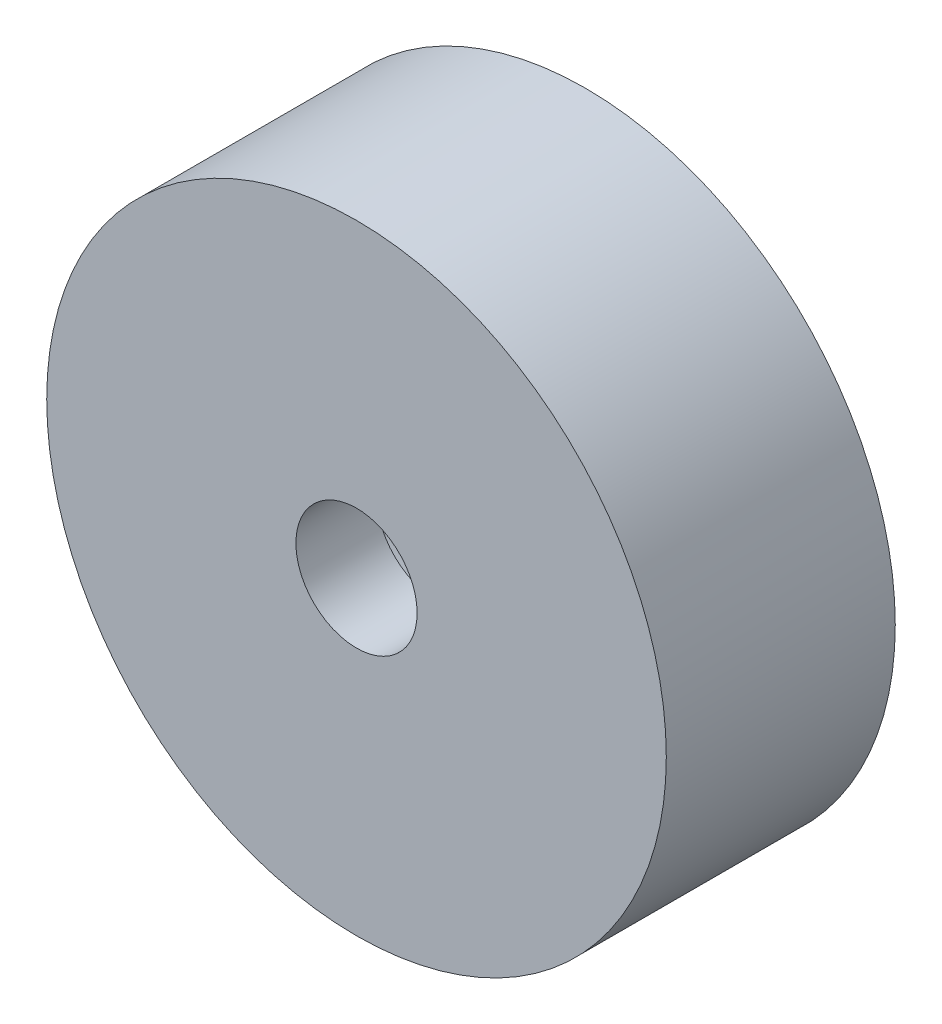
ISO-10303-21;
HEADER;
FILE_DESCRIPTION(('STEP AP214'),'2;1');
FILE_NAME('part.step','',(''),(''),'','','');
FILE_SCHEMA(('AUTOMOTIVE_DESIGN { 1 0 10303 214 1 1 1 1 }'));
ENDSEC;
DATA;
#1=APPLICATION_CONTEXT('core data for automotive mechanical design processes');
#2=APPLICATION_PROTOCOL_DEFINITION('international standard','automotive_design',2000,#1);
#3=PRODUCT_CONTEXT('',#1,'mechanical');
#4=PRODUCT('Part','Part','',(#3));
#5=PRODUCT_RELATED_PRODUCT_CATEGORY('part','',(#4));
#6=PRODUCT_DEFINITION_FORMATION('','',#4);
#7=PRODUCT_DEFINITION_CONTEXT('part definition',#1,'design');
#8=PRODUCT_DEFINITION('design','',#6,#7);
#9=PRODUCT_DEFINITION_SHAPE('','',#8);
#10=(LENGTH_UNIT() NAMED_UNIT(*) SI_UNIT(.MILLI.,.METRE.));
#11=(NAMED_UNIT(*) PLANE_ANGLE_UNIT() SI_UNIT($,.RADIAN.));
#12=(NAMED_UNIT(*) SI_UNIT($,.STERADIAN.) SOLID_ANGLE_UNIT());
#13=UNCERTAINTY_MEASURE_WITH_UNIT(LENGTH_MEASURE(1.E-05),#10,'distance_accuracy_value','');
#14=(GEOMETRIC_REPRESENTATION_CONTEXT(3) GLOBAL_UNCERTAINTY_ASSIGNED_CONTEXT((#13)) GLOBAL_UNIT_ASSIGNED_CONTEXT((#10,
#11,#12)) REPRESENTATION_CONTEXT('',''));
#15=CARTESIAN_POINT('',(0.,0.,0.));
#16=DIRECTION('',(0.,0.,1.));
#17=DIRECTION('',(1.,0.,0.));
#18=AXIS2_PLACEMENT_3D('',#15,#16,#17);
#19=CARTESIAN_POINT('',(0.,0.,3.5));
#20=DIRECTION('',(0.,0.,-1.));
#21=DIRECTION('',(-1.,0.,0.));
#22=AXIS2_PLACEMENT_3D('',#19,#20,#21);
#23=CYLINDRICAL_SURFACE('',#22,9.5);
#24=CARTESIAN_POINT('',(0.,0.,-3.5));
#25=DIRECTION('',(0.,0.,1.));
#26=DIRECTION('',(1.,0.,0.));
#27=AXIS2_PLACEMENT_3D('',#24,#25,#26);
#28=CIRCLE('',#27,9.5);
#29=CARTESIAN_POINT('',(9.5,0.,-3.5));
#30=VERTEX_POINT('',#29);
#31=EDGE_CURVE('E46',#30,#30,#28,.T.);
#32=ORIENTED_EDGE('',*,*,#31,.F.);
#33=EDGE_LOOP('',(#32));
#34=FACE_BOUND('',#33,.T.);
#35=CARTESIAN_POINT('',(0.,0.,2.));
#36=DIRECTION('',(0.,0.,1.));
#37=DIRECTION('',(1.,0.,0.));
#38=AXIS2_PLACEMENT_3D('',#35,#36,#37);
#39=CIRCLE('',#38,9.5);
#40=CARTESIAN_POINT('',(9.5,0.,2.));
#41=VERTEX_POINT('',#40);
#42=EDGE_CURVE('E41',#41,#41,#39,.T.);
#43=ORIENTED_EDGE('',*,*,#42,.T.);
#44=EDGE_LOOP('',(#43));
#45=FACE_BOUND('',#44,.T.);
#46=ADVANCED_FACE('F37',(#34,#45),#23,.F.);
#47=CARTESIAN_POINT('',(0.,0.,-3.5));
#48=DIRECTION('',(0.,0.,1.));
#49=DIRECTION('',(1.,0.,0.));
#50=AXIS2_PLACEMENT_3D('',#47,#48,#49);
#51=PLANE('',#50);
#52=CARTESIAN_POINT('',(0.,0.,-3.5));
#53=DIRECTION('',(0.,0.,1.));
#54=DIRECTION('',(1.,0.,0.));
#55=AXIS2_PLACEMENT_3D('',#52,#53,#54);
#56=CIRCLE('',#55,11.5);
#57=CARTESIAN_POINT('',(11.5,0.,-3.5));
#58=VERTEX_POINT('',#57);
#59=EDGE_CURVE('E10',#58,#58,#56,.T.);
#60=ORIENTED_EDGE('',*,*,#59,.F.);
#61=EDGE_LOOP('',(#60));
#62=FACE_BOUND('',#61,.T.);
#63=ORIENTED_EDGE('',*,*,#31,.T.);
#64=EDGE_LOOP('',(#63));
#65=FACE_BOUND('',#64,.T.);
#66=ADVANCED_FACE('F82',(#62,#65),#51,.F.);
#67=CARTESIAN_POINT('',(0.,0.,3.5));
#68=DIRECTION('',(0.,0.,-1.));
#69=DIRECTION('',(-1.,0.,0.));
#70=AXIS2_PLACEMENT_3D('',#67,#68,#69);
#71=CYLINDRICAL_SURFACE('',#70,11.5);
#72=ORIENTED_EDGE('',*,*,#59,.T.);
#73=EDGE_LOOP('',(#72));
#74=FACE_BOUND('',#73,.T.);
#75=CARTESIAN_POINT('',(0.,0.,5.));
#76=DIRECTION('',(0.,0.,1.));
#77=DIRECTION('',(1.,0.,0.));
#78=AXIS2_PLACEMENT_3D('',#75,#76,#77);
#79=CIRCLE('',#78,11.5);
#80=CARTESIAN_POINT('',(11.5,0.,5.));
#81=VERTEX_POINT('',#80);
#82=EDGE_CURVE('E53',#81,#81,#79,.T.);
#83=ORIENTED_EDGE('',*,*,#82,.F.);
#84=EDGE_LOOP('',(#83));
#85=FACE_BOUND('',#84,.T.);
#86=ADVANCED_FACE('F39',(#74,#85),#71,.T.);
#87=CARTESIAN_POINT('',(0.,0.,2.));
#88=DIRECTION('',(0.,0.,1.));
#89=DIRECTION('',(1.,0.,0.));
#90=AXIS2_PLACEMENT_3D('',#87,#88,#89);
#91=PLANE('',#90);
#92=CARTESIAN_POINT('',(0.,0.,2.));
#93=DIRECTION('',(0.,0.,1.));
#94=DIRECTION('',(1.,0.,0.));
#95=AXIS2_PLACEMENT_3D('',#92,#93,#94);
#96=CIRCLE('',#95,2.25);
#97=CARTESIAN_POINT('',(2.25,0.,2.));
#98=VERTEX_POINT('',#97);
#99=EDGE_CURVE('E58',#98,#98,#96,.T.);
#100=ORIENTED_EDGE('',*,*,#99,.T.);
#101=EDGE_LOOP('',(#100));
#102=FACE_BOUND('',#101,.T.);
#103=ORIENTED_EDGE('',*,*,#42,.F.);
#104=EDGE_LOOP('',(#103));
#105=FACE_BOUND('',#104,.T.);
#106=ADVANCED_FACE('F71',(#102,#105),#91,.F.);
#107=CARTESIAN_POINT('',(0.,0.,5.));
#108=DIRECTION('',(0.,0.,1.));
#109=DIRECTION('',(1.,0.,0.));
#110=AXIS2_PLACEMENT_3D('',#107,#108,#109);
#111=PLANE('',#110);
#112=ORIENTED_EDGE('',*,*,#82,.T.);
#113=EDGE_LOOP('',(#112));
#114=FACE_BOUND('',#113,.T.);
#115=CARTESIAN_POINT('',(0.,0.,5.));
#116=DIRECTION('',(0.,0.,1.));
#117=DIRECTION('',(1.,0.,0.));
#118=AXIS2_PLACEMENT_3D('',#115,#116,#117);
#119=CIRCLE('',#118,2.25);
#120=CARTESIAN_POINT('',(2.25,0.,5.));
#121=VERTEX_POINT('',#120);
#122=EDGE_CURVE('E57',#121,#121,#119,.T.);
#123=ORIENTED_EDGE('',*,*,#122,.F.);
#124=EDGE_LOOP('',(#123));
#125=FACE_BOUND('',#124,.T.);
#126=ADVANCED_FACE('F69',(#114,#125),#111,.T.);
#127=CARTESIAN_POINT('',(0.,0.,5.));
#128=DIRECTION('',(0.,0.,-1.));
#129=DIRECTION('',(-1.,0.,0.));
#130=AXIS2_PLACEMENT_3D('',#127,#128,#129);
#131=CYLINDRICAL_SURFACE('',#130,2.25);
#132=ORIENTED_EDGE('',*,*,#122,.T.);
#133=EDGE_LOOP('',(#132));
#134=FACE_BOUND('',#133,.T.);
#135=ORIENTED_EDGE('',*,*,#99,.F.);
#136=EDGE_LOOP('',(#135));
#137=FACE_BOUND('',#136,.T.);
#138=ADVANCED_FACE('F66',(#134,#137),#131,.F.);
#139=CLOSED_SHELL('',(#46,#66,#86,#106,#126,#138));
#140=MANIFOLD_SOLID_BREP('B2',#139);
#141=ADVANCED_BREP_SHAPE_REPRESENTATION('',(#18,#140),#14);
#142=SHAPE_DEFINITION_REPRESENTATION(#9,#141);
ENDSEC;
END-ISO-10303-21;
